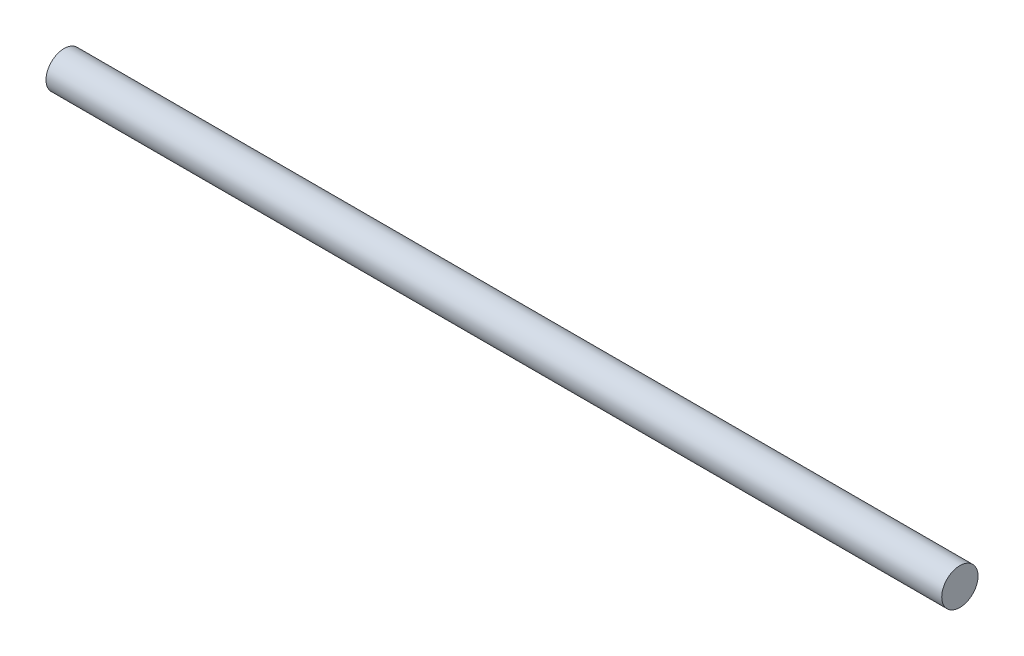
ISO-10303-21;
HEADER;
FILE_DESCRIPTION(('STEP AP214'),'2;1');
FILE_NAME('part.step','',(''),(''),'','','');
FILE_SCHEMA(('AUTOMOTIVE_DESIGN { 1 0 10303 214 1 1 1 1 }'));
ENDSEC;
DATA;
#1=APPLICATION_CONTEXT('core data for automotive mechanical design processes');
#2=APPLICATION_PROTOCOL_DEFINITION('international standard','automotive_design',2000,#1);
#3=PRODUCT_CONTEXT('',#1,'mechanical');
#4=PRODUCT('Part','Part','',(#3));
#5=PRODUCT_RELATED_PRODUCT_CATEGORY('part','',(#4));
#6=PRODUCT_DEFINITION_FORMATION('','',#4);
#7=PRODUCT_DEFINITION_CONTEXT('part definition',#1,'design');
#8=PRODUCT_DEFINITION('design','',#6,#7);
#9=PRODUCT_DEFINITION_SHAPE('','',#8);
#10=(LENGTH_UNIT() NAMED_UNIT(*) SI_UNIT(.MILLI.,.METRE.));
#11=(NAMED_UNIT(*) PLANE_ANGLE_UNIT() SI_UNIT($,.RADIAN.));
#12=(NAMED_UNIT(*) SI_UNIT($,.STERADIAN.) SOLID_ANGLE_UNIT());
#13=UNCERTAINTY_MEASURE_WITH_UNIT(LENGTH_MEASURE(1.E-05),#10,'distance_accuracy_value','');
#14=(GEOMETRIC_REPRESENTATION_CONTEXT(3) GLOBAL_UNCERTAINTY_ASSIGNED_CONTEXT((#13)) GLOBAL_UNIT_ASSIGNED_CONTEXT((#10,
#11,#12)) REPRESENTATION_CONTEXT('',''));
#15=CARTESIAN_POINT('',(0.,0.,0.));
#16=DIRECTION('',(0.,0.,1.));
#17=DIRECTION('',(1.,0.,0.));
#18=AXIS2_PLACEMENT_3D('',#15,#16,#17);
#19=CARTESIAN_POINT('',(-23.9081604551233,0.,0.));
#20=DIRECTION('',(-1.,0.,0.));
#21=DIRECTION('',(0.,0.,1.));
#22=AXIS2_PLACEMENT_3D('',#19,#20,#21);
#23=CYLINDRICAL_SURFACE('',#22,1.5);
#24=CARTESIAN_POINT('',(50.0918395448767,0.,0.));
#25=DIRECTION('',(-1.,0.,0.));
#26=DIRECTION('',(0.,0.,1.));
#27=AXIS2_PLACEMENT_3D('',#24,#25,#26);
#28=CIRCLE('',#27,1.5);
#29=CARTESIAN_POINT('',(50.0918395448767,0.,1.5));
#30=VERTEX_POINT('',#29);
#31=EDGE_CURVE('E37',#30,#30,#28,.T.);
#32=ORIENTED_EDGE('',*,*,#31,.T.);
#33=EDGE_LOOP('',(#32));
#34=FACE_BOUND('',#33,.T.);
#35=CARTESIAN_POINT('',(-23.9081604551233,0.,0.));
#36=DIRECTION('',(-1.,0.,0.));
#37=DIRECTION('',(0.,0.,1.));
#38=AXIS2_PLACEMENT_3D('',#35,#36,#37);
#39=CIRCLE('',#38,1.5);
#40=CARTESIAN_POINT('',(-23.9081604551233,0.,1.5));
#41=VERTEX_POINT('',#40);
#42=EDGE_CURVE('E10',#41,#41,#39,.T.);
#43=ORIENTED_EDGE('',*,*,#42,.F.);
#44=EDGE_LOOP('',(#43));
#45=FACE_BOUND('',#44,.T.);
#46=ADVANCED_FACE('F31',(#34,#45),#23,.T.);
#47=CARTESIAN_POINT('',(-23.9081604551233,-1.5,0.));
#48=DIRECTION('',(1.,0.,0.));
#49=DIRECTION('',(0.,0.,-1.));
#50=AXIS2_PLACEMENT_3D('',#47,#48,#49);
#51=PLANE('',#50);
#52=ORIENTED_EDGE('',*,*,#42,.T.);
#53=EDGE_LOOP('',(#52));
#54=FACE_BOUND('',#53,.T.);
#55=ADVANCED_FACE('F47',(#54),#51,.F.);
#56=CARTESIAN_POINT('',(50.0918395448767,0.,0.));
#57=DIRECTION('',(-1.,0.,0.));
#58=DIRECTION('',(0.,0.,1.));
#59=AXIS2_PLACEMENT_3D('',#56,#57,#58);
#60=PLANE('',#59);
#61=ORIENTED_EDGE('',*,*,#31,.F.);
#62=EDGE_LOOP('',(#61));
#63=FACE_BOUND('',#62,.T.);
#64=ADVANCED_FACE('F45',(#63),#60,.F.);
#65=CLOSED_SHELL('',(#46,#55,#64));
#66=MANIFOLD_SOLID_BREP('B2',#65);
#67=ADVANCED_BREP_SHAPE_REPRESENTATION('',(#18,#66),#14);
#68=SHAPE_DEFINITION_REPRESENTATION(#9,#67);
ENDSEC;
END-ISO-10303-21;
